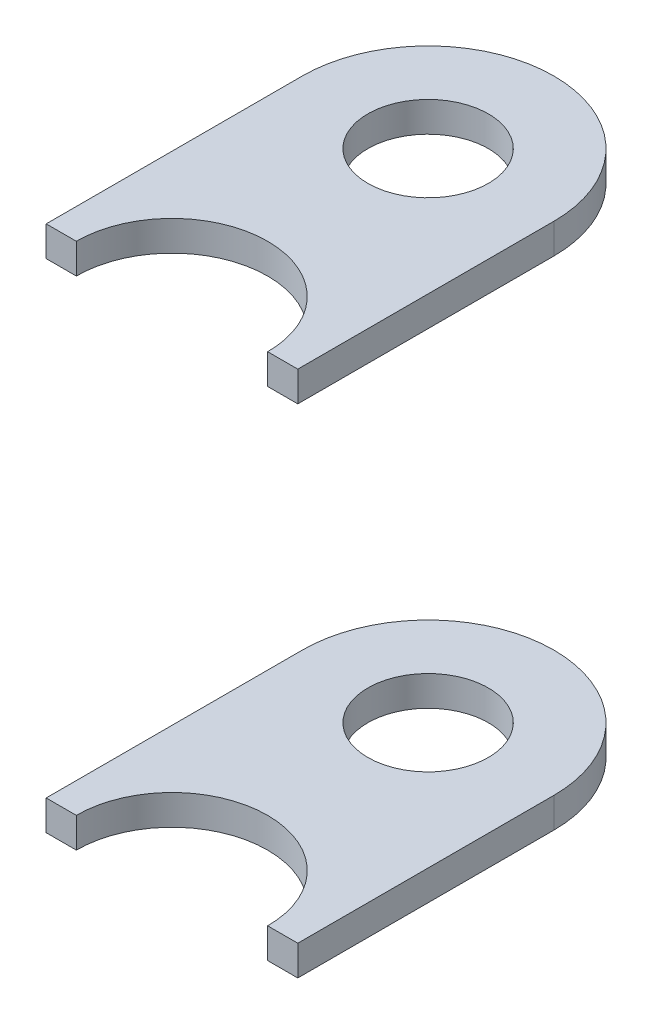
ISO-10303-21;
HEADER;
FILE_DESCRIPTION(('STEP AP214'),'2;1');
FILE_NAME('part.step','',(''),(''),'','','');
FILE_SCHEMA(('AUTOMOTIVE_DESIGN { 1 0 10303 214 1 1 1 1 }'));
ENDSEC;
DATA;
#1=APPLICATION_CONTEXT('core data for automotive mechanical design processes');
#2=APPLICATION_PROTOCOL_DEFINITION('international standard','automotive_design',2000,#1);
#3=PRODUCT_CONTEXT('',#1,'mechanical');
#4=PRODUCT('Part','Part','',(#3));
#5=PRODUCT_RELATED_PRODUCT_CATEGORY('part','',(#4));
#6=PRODUCT_DEFINITION_FORMATION('','',#4);
#7=PRODUCT_DEFINITION_CONTEXT('part definition',#1,'design');
#8=PRODUCT_DEFINITION('design','',#6,#7);
#9=PRODUCT_DEFINITION_SHAPE('','',#8);
#10=(LENGTH_UNIT() NAMED_UNIT(*) SI_UNIT(.MILLI.,.METRE.));
#11=(NAMED_UNIT(*) PLANE_ANGLE_UNIT() SI_UNIT($,.RADIAN.));
#12=(NAMED_UNIT(*) SI_UNIT($,.STERADIAN.) SOLID_ANGLE_UNIT());
#13=UNCERTAINTY_MEASURE_WITH_UNIT(LENGTH_MEASURE(1.E-05),#10,'distance_accuracy_value','');
#14=(GEOMETRIC_REPRESENTATION_CONTEXT(3) GLOBAL_UNCERTAINTY_ASSIGNED_CONTEXT((#13)) GLOBAL_UNIT_ASSIGNED_CONTEXT((#10,
#11,#12)) REPRESENTATION_CONTEXT('',''));
#15=CARTESIAN_POINT('',(0.,0.,0.));
#16=DIRECTION('',(0.,0.,1.));
#17=DIRECTION('',(1.,0.,0.));
#18=AXIS2_PLACEMENT_3D('',#15,#16,#17);
#19=CARTESIAN_POINT('',(0.,-35.,34.));
#20=DIRECTION('',(0.,-1.,0.));
#21=DIRECTION('',(0.,0.,1.));
#22=AXIS2_PLACEMENT_3D('',#19,#20,#21);
#23=PLANE('',#22);
#24=DIRECTION('',(0.,0.,-1.));
#25=VECTOR('',#24,1.);
#26=CARTESIAN_POINT('',(16.7,-35.,0.));
#27=LINE('',#26,#25);
#28=CARTESIAN_POINT('',(16.7,-35.,34.));
#29=VERTEX_POINT('',#28);
#30=CARTESIAN_POINT('',(16.7,-35.,0.));
#31=VERTEX_POINT('',#30);
#32=EDGE_CURVE('E149',#29,#31,#27,.T.);
#33=ORIENTED_EDGE('',*,*,#32,.F.);
#34=DIRECTION('',(1.,0.,0.));
#35=VECTOR('',#34,1.);
#36=CARTESIAN_POINT('',(16.7,-35.,34.));
#37=LINE('',#36,#35);
#38=CARTESIAN_POINT('',(12.7,-35.,34.));
#39=VERTEX_POINT('',#38);
#40=EDGE_CURVE('E129',#39,#29,#37,.T.);
#41=ORIENTED_EDGE('',*,*,#40,.F.);
#42=CARTESIAN_POINT('',(0.,-35.,34.));
#43=DIRECTION('',(0.,-1.,0.));
#44=DIRECTION('',(0.,0.,1.));
#45=AXIS2_PLACEMENT_3D('',#42,#43,#44);
#46=CIRCLE('',#45,12.7);
#47=CARTESIAN_POINT('',(-12.7,-35.,34.));
#48=VERTEX_POINT('',#47);
#49=EDGE_CURVE('E110',#48,#39,#46,.T.);
#50=ORIENTED_EDGE('',*,*,#49,.F.);
#51=DIRECTION('',(1.,0.,0.));
#52=VECTOR('',#51,1.);
#53=CARTESIAN_POINT('',(-12.7,-35.,34.));
#54=LINE('',#53,#52);
#55=CARTESIAN_POINT('',(-16.7,-35.,34.));
#56=VERTEX_POINT('',#55);
#57=EDGE_CURVE('E120',#56,#48,#54,.T.);
#58=ORIENTED_EDGE('',*,*,#57,.F.);
#59=DIRECTION('',(0.,0.,1.));
#60=VECTOR('',#59,1.);
#61=CARTESIAN_POINT('',(-16.7,-35.,34.));
#62=LINE('',#61,#60);
#63=CARTESIAN_POINT('',(-16.7,-35.,0.));
#64=VERTEX_POINT('',#63);
#65=EDGE_CURVE('E125',#64,#56,#62,.T.);
#66=ORIENTED_EDGE('',*,*,#65,.F.);
#67=CARTESIAN_POINT('',(0.,-35.,0.));
#68=DIRECTION('',(0.,1.,0.));
#69=DIRECTION('',(0.,0.,-1.));
#70=AXIS2_PLACEMENT_3D('',#67,#68,#69);
#71=CIRCLE('',#70,16.7);
#72=EDGE_CURVE('E154',#31,#64,#71,.T.);
#73=ORIENTED_EDGE('',*,*,#72,.F.);
#74=EDGE_LOOP('',(#33,#41,#50,#58,#66,#73));
#75=FACE_BOUND('',#74,.T.);
#76=CARTESIAN_POINT('',(0.,-35.,0.));
#77=DIRECTION('',(0.,1.,0.));
#78=DIRECTION('',(0.,0.,1.));
#79=AXIS2_PLACEMENT_3D('',#76,#77,#78);
#80=CIRCLE('',#79,8.);
#81=CARTESIAN_POINT('',(0.,-35.,8.));
#82=VERTEX_POINT('',#81);
#83=EDGE_CURVE('E138',#82,#82,#80,.T.);
#84=ORIENTED_EDGE('',*,*,#83,.T.);
#85=EDGE_LOOP('',(#84));
#86=FACE_BOUND('',#85,.T.);
#87=ADVANCED_FACE('F49',(#75,#86),#23,.T.);
#88=CARTESIAN_POINT('',(0.,-31.,34.));
#89=DIRECTION('',(0.,-1.,0.));
#90=DIRECTION('',(0.,0.,1.));
#91=AXIS2_PLACEMENT_3D('',#88,#89,#90);
#92=PLANE('',#91);
#93=DIRECTION('',(0.,0.,-1.));
#94=VECTOR('',#93,1.);
#95=CARTESIAN_POINT('',(16.7,-31.,0.));
#96=LINE('',#95,#94);
#97=CARTESIAN_POINT('',(16.7,-31.,34.));
#98=VERTEX_POINT('',#97);
#99=CARTESIAN_POINT('',(16.7,-31.,0.));
#100=VERTEX_POINT('',#99);
#101=EDGE_CURVE('E134',#98,#100,#96,.T.);
#102=ORIENTED_EDGE('',*,*,#101,.T.);
#103=CARTESIAN_POINT('',(0.,-31.,0.));
#104=DIRECTION('',(0.,1.,0.));
#105=DIRECTION('',(0.,0.,-1.));
#106=AXIS2_PLACEMENT_3D('',#103,#104,#105);
#107=CIRCLE('',#106,16.7);
#108=CARTESIAN_POINT('',(-16.7,-31.,0.));
#109=VERTEX_POINT('',#108);
#110=EDGE_CURVE('E137',#100,#109,#107,.T.);
#111=ORIENTED_EDGE('',*,*,#110,.T.);
#112=DIRECTION('',(0.,0.,1.));
#113=VECTOR('',#112,1.);
#114=CARTESIAN_POINT('',(-16.7,-31.,34.));
#115=LINE('',#114,#113);
#116=CARTESIAN_POINT('',(-16.7,-31.,34.));
#117=VERTEX_POINT('',#116);
#118=EDGE_CURVE('E141',#109,#117,#115,.T.);
#119=ORIENTED_EDGE('',*,*,#118,.T.);
#120=DIRECTION('',(1.,0.,0.));
#121=VECTOR('',#120,1.);
#122=CARTESIAN_POINT('',(-12.7,-31.,34.));
#123=LINE('',#122,#121);
#124=CARTESIAN_POINT('',(-12.7,-31.,34.));
#125=VERTEX_POINT('',#124);
#126=EDGE_CURVE('E144',#117,#125,#123,.T.);
#127=ORIENTED_EDGE('',*,*,#126,.T.);
#128=CARTESIAN_POINT('',(0.,-31.,34.));
#129=DIRECTION('',(0.,-1.,0.));
#130=DIRECTION('',(0.,0.,1.));
#131=AXIS2_PLACEMENT_3D('',#128,#129,#130);
#132=CIRCLE('',#131,12.7);
#133=CARTESIAN_POINT('',(12.7,-31.,34.));
#134=VERTEX_POINT('',#133);
#135=EDGE_CURVE('E113',#125,#134,#132,.T.);
#136=ORIENTED_EDGE('',*,*,#135,.T.);
#137=DIRECTION('',(1.,0.,0.));
#138=VECTOR('',#137,1.);
#139=CARTESIAN_POINT('',(16.7,-31.,34.));
#140=LINE('',#139,#138);
#141=EDGE_CURVE('E147',#134,#98,#140,.T.);
#142=ORIENTED_EDGE('',*,*,#141,.T.);
#143=EDGE_LOOP('',(#102,#111,#119,#127,#136,#142));
#144=FACE_BOUND('',#143,.T.);
#145=CARTESIAN_POINT('',(0.,-31.,0.));
#146=DIRECTION('',(0.,1.,0.));
#147=DIRECTION('',(0.,0.,1.));
#148=AXIS2_PLACEMENT_3D('',#145,#146,#147);
#149=CIRCLE('',#148,8.);
#150=CARTESIAN_POINT('',(0.,-31.,8.));
#151=VERTEX_POINT('',#150);
#152=EDGE_CURVE('E163',#151,#151,#149,.T.);
#153=ORIENTED_EDGE('',*,*,#152,.F.);
#154=EDGE_LOOP('',(#153));
#155=FACE_BOUND('',#154,.T.);
#156=ADVANCED_FACE('F158',(#144,#155),#92,.F.);
#157=CARTESIAN_POINT('',(16.7,-35.,0.));
#158=DIRECTION('',(-1.,0.,0.));
#159=DIRECTION('',(0.,0.,1.));
#160=AXIS2_PLACEMENT_3D('',#157,#158,#159);
#161=PLANE('',#160);
#162=ORIENTED_EDGE('',*,*,#101,.F.);
#163=DIRECTION('',(0.,1.,0.));
#164=VECTOR('',#163,1.);
#165=CARTESIAN_POINT('',(16.7,-35.,34.));
#166=LINE('',#165,#164);
#167=EDGE_CURVE('E66',#29,#98,#166,.T.);
#168=ORIENTED_EDGE('',*,*,#167,.F.);
#169=ORIENTED_EDGE('',*,*,#32,.T.);
#170=DIRECTION('',(0.,1.,0.));
#171=VECTOR('',#170,1.);
#172=CARTESIAN_POINT('',(16.7,-35.,0.));
#173=LINE('',#172,#171);
#174=EDGE_CURVE('E12',#31,#100,#173,.T.);
#175=ORIENTED_EDGE('',*,*,#174,.T.);
#176=EDGE_LOOP('',(#162,#168,#169,#175));
#177=FACE_BOUND('',#176,.T.);
#178=ADVANCED_FACE('F51',(#177),#161,.F.);
#179=CARTESIAN_POINT('',(0.,-35.,0.));
#180=DIRECTION('',(0.,1.,0.));
#181=DIRECTION('',(0.,0.,-1.));
#182=AXIS2_PLACEMENT_3D('',#179,#180,#181);
#183=CYLINDRICAL_SURFACE('',#182,16.7);
#184=ORIENTED_EDGE('',*,*,#110,.F.);
#185=ORIENTED_EDGE('',*,*,#174,.F.);
#186=ORIENTED_EDGE('',*,*,#72,.T.);
#187=DIRECTION('',(0.,1.,0.));
#188=VECTOR('',#187,1.);
#189=CARTESIAN_POINT('',(-16.7,-35.,0.));
#190=LINE('',#189,#188);
#191=EDGE_CURVE('E58',#64,#109,#190,.T.);
#192=ORIENTED_EDGE('',*,*,#191,.T.);
#193=EDGE_LOOP('',(#184,#185,#186,#192));
#194=FACE_BOUND('',#193,.T.);
#195=ADVANCED_FACE('F153',(#194),#183,.T.);
#196=CARTESIAN_POINT('',(-16.7,-35.,34.));
#197=DIRECTION('',(1.,0.,0.));
#198=DIRECTION('',(0.,0.,-1.));
#199=AXIS2_PLACEMENT_3D('',#196,#197,#198);
#200=PLANE('',#199);
#201=ORIENTED_EDGE('',*,*,#118,.F.);
#202=ORIENTED_EDGE('',*,*,#191,.F.);
#203=ORIENTED_EDGE('',*,*,#65,.T.);
#204=DIRECTION('',(0.,1.,0.));
#205=VECTOR('',#204,1.);
#206=CARTESIAN_POINT('',(-16.7,-35.,34.));
#207=LINE('',#206,#205);
#208=EDGE_CURVE('E117',#56,#117,#207,.T.);
#209=ORIENTED_EDGE('',*,*,#208,.T.);
#210=EDGE_LOOP('',(#201,#202,#203,#209));
#211=FACE_BOUND('',#210,.T.);
#212=ADVANCED_FACE('F156',(#211),#200,.F.);
#213=CARTESIAN_POINT('',(-12.7,-35.,34.));
#214=DIRECTION('',(0.,0.,-1.));
#215=DIRECTION('',(-1.,0.,0.));
#216=AXIS2_PLACEMENT_3D('',#213,#214,#215);
#217=PLANE('',#216);
#218=ORIENTED_EDGE('',*,*,#126,.F.);
#219=ORIENTED_EDGE('',*,*,#208,.F.);
#220=ORIENTED_EDGE('',*,*,#57,.T.);
#221=DIRECTION('',(0.,1.,0.));
#222=VECTOR('',#221,1.);
#223=CARTESIAN_POINT('',(-12.7,-35.,34.));
#224=LINE('',#223,#222);
#225=EDGE_CURVE('E106',#48,#125,#224,.T.);
#226=ORIENTED_EDGE('',*,*,#225,.T.);
#227=EDGE_LOOP('',(#218,#219,#220,#226));
#228=FACE_BOUND('',#227,.T.);
#229=ADVANCED_FACE('F121',(#228),#217,.F.);
#230=CARTESIAN_POINT('',(0.,-35.,34.));
#231=DIRECTION('',(0.,1.,0.));
#232=DIRECTION('',(0.,0.,-1.));
#233=AXIS2_PLACEMENT_3D('',#230,#231,#232);
#234=CYLINDRICAL_SURFACE('',#233,12.7);
#235=ORIENTED_EDGE('',*,*,#135,.F.);
#236=ORIENTED_EDGE('',*,*,#225,.F.);
#237=ORIENTED_EDGE('',*,*,#49,.T.);
#238=DIRECTION('',(0.,1.,0.));
#239=VECTOR('',#238,1.);
#240=CARTESIAN_POINT('',(12.7,-35.,34.));
#241=LINE('',#240,#239);
#242=EDGE_CURVE('E88',#39,#134,#241,.T.);
#243=ORIENTED_EDGE('',*,*,#242,.T.);
#244=EDGE_LOOP('',(#235,#236,#237,#243));
#245=FACE_BOUND('',#244,.T.);
#246=ADVANCED_FACE('F108',(#245),#234,.F.);
#247=CARTESIAN_POINT('',(16.7,-35.,34.));
#248=DIRECTION('',(0.,0.,-1.));
#249=DIRECTION('',(-1.,0.,0.));
#250=AXIS2_PLACEMENT_3D('',#247,#248,#249);
#251=PLANE('',#250);
#252=ORIENTED_EDGE('',*,*,#141,.F.);
#253=ORIENTED_EDGE('',*,*,#242,.F.);
#254=ORIENTED_EDGE('',*,*,#40,.T.);
#255=ORIENTED_EDGE('',*,*,#167,.T.);
#256=EDGE_LOOP('',(#252,#253,#254,#255));
#257=FACE_BOUND('',#256,.T.);
#258=ADVANCED_FACE('F172',(#257),#251,.F.);
#259=CARTESIAN_POINT('',(0.,-35.,0.));
#260=DIRECTION('',(0.,1.,0.));
#261=DIRECTION('',(0.,0.,-1.));
#262=AXIS2_PLACEMENT_3D('',#259,#260,#261);
#263=CYLINDRICAL_SURFACE('',#262,8.);
#264=ORIENTED_EDGE('',*,*,#83,.F.);
#265=EDGE_LOOP('',(#264));
#266=FACE_BOUND('',#265,.T.);
#267=ORIENTED_EDGE('',*,*,#152,.T.);
#268=EDGE_LOOP('',(#267));
#269=FACE_BOUND('',#268,.T.);
#270=ADVANCED_FACE('F169',(#266,#269),#263,.F.);
#271=CLOSED_SHELL('',(#87,#156,#178,#195,#212,#229,#246,#258,#270));
#272=MANIFOLD_SOLID_BREP('B2',#271);
#273=CARTESIAN_POINT('',(0.,35.,34.));
#274=DIRECTION('',(0.,1.,0.));
#275=DIRECTION('',(0.,0.,1.));
#276=AXIS2_PLACEMENT_3D('',#273,#274,#275);
#277=PLANE('',#276);
#278=DIRECTION('',(0.,0.,-1.));
#279=VECTOR('',#278,1.);
#280=CARTESIAN_POINT('',(16.7,35.,0.));
#281=LINE('',#280,#279);
#282=CARTESIAN_POINT('',(16.7,35.,34.));
#283=VERTEX_POINT('',#282);
#284=CARTESIAN_POINT('',(16.7,35.,0.));
#285=VERTEX_POINT('',#284);
#286=EDGE_CURVE('E378',#283,#285,#281,.T.);
#287=ORIENTED_EDGE('',*,*,#286,.T.);
#288=CARTESIAN_POINT('',(0.,35.,0.));
#289=DIRECTION('',(0.,1.,0.));
#290=DIRECTION('',(0.,0.,-1.));
#291=AXIS2_PLACEMENT_3D('',#288,#289,#290);
#292=CIRCLE('',#291,16.7);
#293=CARTESIAN_POINT('',(-16.7,35.,0.));
#294=VERTEX_POINT('',#293);
#295=EDGE_CURVE('E336',#285,#294,#292,.T.);
#296=ORIENTED_EDGE('',*,*,#295,.T.);
#297=DIRECTION('',(0.,0.,1.));
#298=VECTOR('',#297,1.);
#299=CARTESIAN_POINT('',(-16.7,35.,34.));
#300=LINE('',#299,#298);
#301=CARTESIAN_POINT('',(-16.7,35.,34.));
#302=VERTEX_POINT('',#301);
#303=EDGE_CURVE('E349',#294,#302,#300,.T.);
#304=ORIENTED_EDGE('',*,*,#303,.T.);
#305=DIRECTION('',(1.,0.,0.));
#306=VECTOR('',#305,1.);
#307=CARTESIAN_POINT('',(-12.7,35.,34.));
#308=LINE('',#307,#306);
#309=CARTESIAN_POINT('',(-12.7,35.,34.));
#310=VERTEX_POINT('',#309);
#311=EDGE_CURVE('E343',#302,#310,#308,.T.);
#312=ORIENTED_EDGE('',*,*,#311,.T.);
#313=CARTESIAN_POINT('',(0.,35.,34.));
#314=DIRECTION('',(0.,-1.,0.));
#315=DIRECTION('',(0.,0.,1.));
#316=AXIS2_PLACEMENT_3D('',#313,#314,#315);
#317=CIRCLE('',#316,12.7);
#318=CARTESIAN_POINT('',(12.7,35.,34.));
#319=VERTEX_POINT('',#318);
#320=EDGE_CURVE('E347',#310,#319,#317,.T.);
#321=ORIENTED_EDGE('',*,*,#320,.T.);
#322=DIRECTION('',(1.,0.,0.));
#323=VECTOR('',#322,1.);
#324=CARTESIAN_POINT('',(16.7,35.,34.));
#325=LINE('',#324,#323);
#326=EDGE_CURVE('E299',#319,#283,#325,.T.);
#327=ORIENTED_EDGE('',*,*,#326,.T.);
#328=EDGE_LOOP('',(#287,#296,#304,#312,#321,#327));
#329=FACE_BOUND('',#328,.T.);
#330=CARTESIAN_POINT('',(0.,35.,0.));
#331=DIRECTION('',(0.,1.,0.));
#332=DIRECTION('',(0.,0.,1.));
#333=AXIS2_PLACEMENT_3D('',#330,#331,#332);
#334=CIRCLE('',#333,8.);
#335=CARTESIAN_POINT('',(0.,35.,8.));
#336=VERTEX_POINT('',#335);
#337=EDGE_CURVE('E371',#336,#336,#334,.T.);
#338=ORIENTED_EDGE('',*,*,#337,.F.);
#339=EDGE_LOOP('',(#338));
#340=FACE_BOUND('',#339,.T.);
#341=ADVANCED_FACE('F282',(#329,#340),#277,.T.);
#342=CARTESIAN_POINT('',(0.,31.,34.));
#343=DIRECTION('',(0.,1.,0.));
#344=DIRECTION('',(0.,0.,1.));
#345=AXIS2_PLACEMENT_3D('',#342,#343,#344);
#346=PLANE('',#345);
#347=DIRECTION('',(0.,0.,-1.));
#348=VECTOR('',#347,1.);
#349=CARTESIAN_POINT('',(16.7,31.,0.));
#350=LINE('',#349,#348);
#351=CARTESIAN_POINT('',(16.7,31.,34.));
#352=VERTEX_POINT('',#351);
#353=CARTESIAN_POINT('',(16.7,31.,0.));
#354=VERTEX_POINT('',#353);
#355=EDGE_CURVE('E367',#352,#354,#350,.T.);
#356=ORIENTED_EDGE('',*,*,#355,.F.);
#357=DIRECTION('',(1.,0.,0.));
#358=VECTOR('',#357,1.);
#359=CARTESIAN_POINT('',(16.7,31.,34.));
#360=LINE('',#359,#358);
#361=CARTESIAN_POINT('',(12.7,31.,34.));
#362=VERTEX_POINT('',#361);
#363=EDGE_CURVE('E328',#362,#352,#360,.T.);
#364=ORIENTED_EDGE('',*,*,#363,.F.);
#365=CARTESIAN_POINT('',(0.,31.,34.));
#366=DIRECTION('',(0.,-1.,0.));
#367=DIRECTION('',(0.,0.,1.));
#368=AXIS2_PLACEMENT_3D('',#365,#366,#367);
#369=CIRCLE('',#368,12.7);
#370=CARTESIAN_POINT('',(-12.7,31.,34.));
#371=VERTEX_POINT('',#370);
#372=EDGE_CURVE('E322',#371,#362,#369,.T.);
#373=ORIENTED_EDGE('',*,*,#372,.F.);
#374=DIRECTION('',(1.,0.,0.));
#375=VECTOR('',#374,1.);
#376=CARTESIAN_POINT('',(-12.7,31.,34.));
#377=LINE('',#376,#375);
#378=CARTESIAN_POINT('',(-16.7,31.,34.));
#379=VERTEX_POINT('',#378);
#380=EDGE_CURVE('E357',#379,#371,#377,.T.);
#381=ORIENTED_EDGE('',*,*,#380,.F.);
#382=DIRECTION('',(0.,0.,1.));
#383=VECTOR('',#382,1.);
#384=CARTESIAN_POINT('',(-16.7,31.,34.));
#385=LINE('',#384,#383);
#386=CARTESIAN_POINT('',(-16.7,31.,0.));
#387=VERTEX_POINT('',#386);
#388=EDGE_CURVE('E373',#387,#379,#385,.T.);
#389=ORIENTED_EDGE('',*,*,#388,.F.);
#390=CARTESIAN_POINT('',(0.,31.,0.));
#391=DIRECTION('',(0.,1.,0.));
#392=DIRECTION('',(0.,0.,-1.));
#393=AXIS2_PLACEMENT_3D('',#390,#391,#392);
#394=CIRCLE('',#393,16.7);
#395=EDGE_CURVE('E370',#354,#387,#394,.T.);
#396=ORIENTED_EDGE('',*,*,#395,.F.);
#397=EDGE_LOOP('',(#356,#364,#373,#381,#389,#396));
#398=FACE_BOUND('',#397,.T.);
#399=CARTESIAN_POINT('',(0.,31.,0.));
#400=DIRECTION('',(0.,1.,0.));
#401=DIRECTION('',(0.,0.,1.));
#402=AXIS2_PLACEMENT_3D('',#399,#400,#401);
#403=CIRCLE('',#402,8.);
#404=CARTESIAN_POINT('',(0.,31.,8.));
#405=VERTEX_POINT('',#404);
#406=EDGE_CURVE('E507',#405,#405,#403,.T.);
#407=ORIENTED_EDGE('',*,*,#406,.T.);
#408=EDGE_LOOP('',(#407));
#409=FACE_BOUND('',#408,.T.);
#410=ADVANCED_FACE('F387',(#398,#409),#346,.F.);
#411=CARTESIAN_POINT('',(16.7,35.,0.));
#412=DIRECTION('',(-1.,0.,0.));
#413=DIRECTION('',(0.,0.,1.));
#414=AXIS2_PLACEMENT_3D('',#411,#412,#413);
#415=PLANE('',#414);
#416=ORIENTED_EDGE('',*,*,#355,.T.);
#417=DIRECTION('',(0.,-1.,0.));
#418=VECTOR('',#417,1.);
#419=CARTESIAN_POINT('',(16.7,35.,0.));
#420=LINE('',#419,#418);
#421=EDGE_CURVE('E47',#285,#354,#420,.T.);
#422=ORIENTED_EDGE('',*,*,#421,.F.);
#423=ORIENTED_EDGE('',*,*,#286,.F.);
#424=DIRECTION('',(0.,-1.,0.));
#425=VECTOR('',#424,1.);
#426=CARTESIAN_POINT('',(16.7,35.,34.));
#427=LINE('',#426,#425);
#428=EDGE_CURVE('E363',#283,#352,#427,.T.);
#429=ORIENTED_EDGE('',*,*,#428,.T.);
#430=EDGE_LOOP('',(#416,#422,#423,#429));
#431=FACE_BOUND('',#430,.T.);
#432=ADVANCED_FACE('F284',(#431),#415,.F.);
#433=CARTESIAN_POINT('',(0.,35.,0.));
#434=DIRECTION('',(0.,-1.,0.));
#435=DIRECTION('',(0.,0.,-1.));
#436=AXIS2_PLACEMENT_3D('',#433,#434,#435);
#437=CYLINDRICAL_SURFACE('',#436,16.7);
#438=ORIENTED_EDGE('',*,*,#395,.T.);
#439=DIRECTION('',(0.,-1.,0.));
#440=VECTOR('',#439,1.);
#441=CARTESIAN_POINT('',(-16.7,35.,0.));
#442=LINE('',#441,#440);
#443=EDGE_CURVE('E291',#294,#387,#442,.T.);
#444=ORIENTED_EDGE('',*,*,#443,.F.);
#445=ORIENTED_EDGE('',*,*,#295,.F.);
#446=ORIENTED_EDGE('',*,*,#421,.T.);
#447=EDGE_LOOP('',(#438,#444,#445,#446));
#448=FACE_BOUND('',#447,.T.);
#449=ADVANCED_FACE('F412',(#448),#437,.T.);
#450=CARTESIAN_POINT('',(-16.7,35.,34.));
#451=DIRECTION('',(1.,0.,0.));
#452=DIRECTION('',(0.,0.,-1.));
#453=AXIS2_PLACEMENT_3D('',#450,#451,#452);
#454=PLANE('',#453);
#455=ORIENTED_EDGE('',*,*,#388,.T.);
#456=DIRECTION('',(0.,-1.,0.));
#457=VECTOR('',#456,1.);
#458=CARTESIAN_POINT('',(-16.7,35.,34.));
#459=LINE('',#458,#457);
#460=EDGE_CURVE('E358',#302,#379,#459,.T.);
#461=ORIENTED_EDGE('',*,*,#460,.F.);
#462=ORIENTED_EDGE('',*,*,#303,.F.);
#463=ORIENTED_EDGE('',*,*,#443,.T.);
#464=EDGE_LOOP('',(#455,#461,#462,#463));
#465=FACE_BOUND('',#464,.T.);
#466=ADVANCED_FACE('F384',(#465),#454,.F.);
#467=CARTESIAN_POINT('',(-12.7,35.,34.));
#468=DIRECTION('',(0.,0.,-1.));
#469=DIRECTION('',(-1.,0.,0.));
#470=AXIS2_PLACEMENT_3D('',#467,#468,#469);
#471=PLANE('',#470);
#472=ORIENTED_EDGE('',*,*,#380,.T.);
#473=DIRECTION('',(0.,-1.,0.));
#474=VECTOR('',#473,1.);
#475=CARTESIAN_POINT('',(-12.7,35.,34.));
#476=LINE('',#475,#474);
#477=EDGE_CURVE('E354',#310,#371,#476,.T.);
#478=ORIENTED_EDGE('',*,*,#477,.F.);
#479=ORIENTED_EDGE('',*,*,#311,.F.);
#480=ORIENTED_EDGE('',*,*,#460,.T.);
#481=EDGE_LOOP('',(#472,#478,#479,#480));
#482=FACE_BOUND('',#481,.T.);
#483=ADVANCED_FACE('F355',(#482),#471,.F.);
#484=CARTESIAN_POINT('',(0.,35.,34.));
#485=DIRECTION('',(0.,-1.,0.));
#486=DIRECTION('',(0.,0.,-1.));
#487=AXIS2_PLACEMENT_3D('',#484,#485,#486);
#488=CYLINDRICAL_SURFACE('',#487,12.7);
#489=ORIENTED_EDGE('',*,*,#372,.T.);
#490=DIRECTION('',(0.,-1.,0.));
#491=VECTOR('',#490,1.);
#492=CARTESIAN_POINT('',(12.7,35.,34.));
#493=LINE('',#492,#491);
#494=EDGE_CURVE('E359',#319,#362,#493,.T.);
#495=ORIENTED_EDGE('',*,*,#494,.F.);
#496=ORIENTED_EDGE('',*,*,#320,.F.);
#497=ORIENTED_EDGE('',*,*,#477,.T.);
#498=EDGE_LOOP('',(#489,#495,#496,#497));
#499=FACE_BOUND('',#498,.T.);
#500=ADVANCED_FACE('F361',(#499),#488,.F.);
#501=CARTESIAN_POINT('',(16.7,35.,34.));
#502=DIRECTION('',(0.,0.,-1.));
#503=DIRECTION('',(-1.,0.,0.));
#504=AXIS2_PLACEMENT_3D('',#501,#502,#503);
#505=PLANE('',#504);
#506=ORIENTED_EDGE('',*,*,#363,.T.);
#507=ORIENTED_EDGE('',*,*,#428,.F.);
#508=ORIENTED_EDGE('',*,*,#326,.F.);
#509=ORIENTED_EDGE('',*,*,#494,.T.);
#510=EDGE_LOOP('',(#506,#507,#508,#509));
#511=FACE_BOUND('',#510,.T.);
#512=ADVANCED_FACE('F392',(#511),#505,.F.);
#513=CARTESIAN_POINT('',(0.,35.,0.));
#514=DIRECTION('',(0.,-1.,0.));
#515=DIRECTION('',(0.,0.,-1.));
#516=AXIS2_PLACEMENT_3D('',#513,#514,#515);
#517=CYLINDRICAL_SURFACE('',#516,8.);
#518=ORIENTED_EDGE('',*,*,#337,.T.);
#519=EDGE_LOOP('',(#518));
#520=FACE_BOUND('',#519,.T.);
#521=ORIENTED_EDGE('',*,*,#406,.F.);
#522=EDGE_LOOP('',(#521));
#523=FACE_BOUND('',#522,.T.);
#524=ADVANCED_FACE('F394',(#520,#523),#517,.F.);
#525=CLOSED_SHELL('',(#341,#410,#432,#449,#466,#483,#500,#512,#524));
#526=MANIFOLD_SOLID_BREP('B6',#525);
#527=ADVANCED_BREP_SHAPE_REPRESENTATION('',(#18,#272,#526),#14);
#528=SHAPE_DEFINITION_REPRESENTATION(#9,#527);
ENDSEC;
END-ISO-10303-21;
